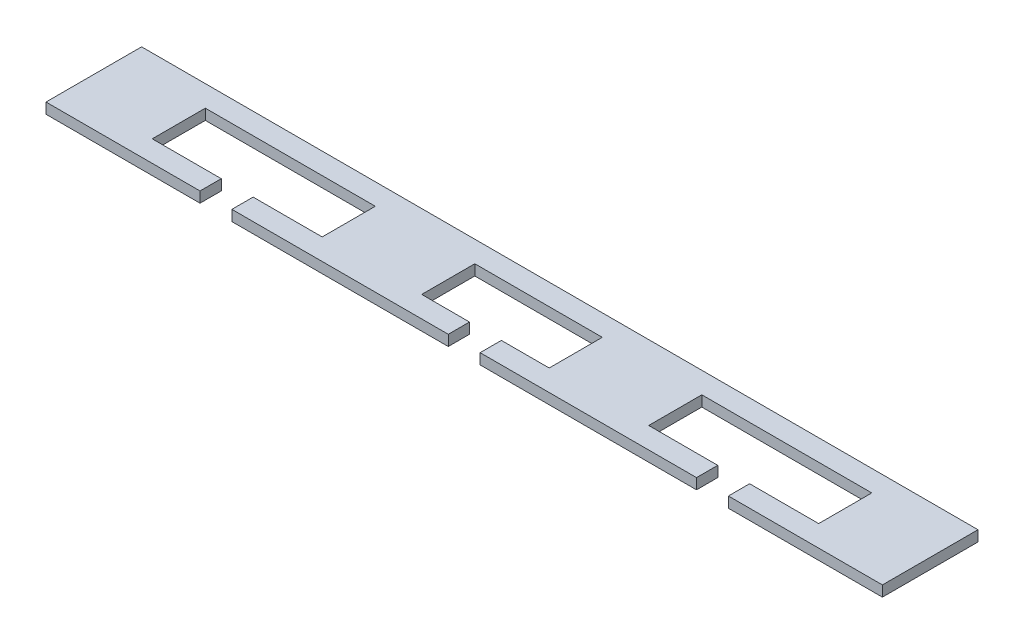
ISO-10303-21;
HEADER;
FILE_DESCRIPTION(('STEP AP214'),'2;1');
FILE_NAME('part.step','',(''),(''),'','','');
FILE_SCHEMA(('AUTOMOTIVE_DESIGN { 1 0 10303 214 1 1 1 1 }'));
ENDSEC;
DATA;
#1=APPLICATION_CONTEXT('core data for automotive mechanical design processes');
#2=APPLICATION_PROTOCOL_DEFINITION('international standard','automotive_design',2000,#1);
#3=PRODUCT_CONTEXT('',#1,'mechanical');
#4=PRODUCT('Part','Part','',(#3));
#5=PRODUCT_RELATED_PRODUCT_CATEGORY('part','',(#4));
#6=PRODUCT_DEFINITION_FORMATION('','',#4);
#7=PRODUCT_DEFINITION_CONTEXT('part definition',#1,'design');
#8=PRODUCT_DEFINITION('design','',#6,#7);
#9=PRODUCT_DEFINITION_SHAPE('','',#8);
#10=(LENGTH_UNIT() NAMED_UNIT(*) SI_UNIT(.MILLI.,.METRE.));
#11=(NAMED_UNIT(*) PLANE_ANGLE_UNIT() SI_UNIT($,.RADIAN.));
#12=(NAMED_UNIT(*) SI_UNIT($,.STERADIAN.) SOLID_ANGLE_UNIT());
#13=UNCERTAINTY_MEASURE_WITH_UNIT(LENGTH_MEASURE(1.E-05),#10,'distance_accuracy_value','');
#14=(GEOMETRIC_REPRESENTATION_CONTEXT(3) GLOBAL_UNCERTAINTY_ASSIGNED_CONTEXT((#13)) GLOBAL_UNIT_ASSIGNED_CONTEXT((#10,
#11,#12)) REPRESENTATION_CONTEXT('',''));
#15=CARTESIAN_POINT('',(0.,0.,0.));
#16=DIRECTION('',(0.,0.,1.));
#17=DIRECTION('',(1.,0.,0.));
#18=AXIS2_PLACEMENT_3D('',#15,#16,#17);
#19=CARTESIAN_POINT('',(0.,12.7,0.));
#20=DIRECTION('',(0.,0.,-1.));
#21=DIRECTION('',(-1.,0.,0.));
#22=AXIS2_PLACEMENT_3D('',#19,#20,#21);
#23=PLANE('',#22);
#24=DIRECTION('',(1.,0.,0.));
#25=VECTOR('',#24,1.);
#26=CARTESIAN_POINT('',(0.,0.,0.));
#27=LINE('',#26,#25);
#28=CARTESIAN_POINT('',(0.,0.,0.));
#29=VERTEX_POINT('',#28);
#30=CARTESIAN_POINT('',(184.15,0.,0.));
#31=VERTEX_POINT('',#30);
#32=EDGE_CURVE('E260',#29,#31,#27,.T.);
#33=ORIENTED_EDGE('',*,*,#32,.T.);
#34=DIRECTION('',(0.,-1.,0.));
#35=VECTOR('',#34,1.);
#36=CARTESIAN_POINT('',(184.15,12.7,0.));
#37=LINE('',#36,#35);
#38=CARTESIAN_POINT('',(184.15,12.7,0.));
#39=VERTEX_POINT('',#38);
#40=EDGE_CURVE('E11',#39,#31,#37,.T.);
#41=ORIENTED_EDGE('',*,*,#40,.F.);
#42=DIRECTION('',(1.,0.,0.));
#43=VECTOR('',#42,1.);
#44=CARTESIAN_POINT('',(0.,12.7,0.));
#45=LINE('',#44,#43);
#46=CARTESIAN_POINT('',(0.,12.7,0.));
#47=VERTEX_POINT('',#46);
#48=EDGE_CURVE('E344',#47,#39,#45,.T.);
#49=ORIENTED_EDGE('',*,*,#48,.F.);
#50=DIRECTION('',(0.,-1.,0.));
#51=VECTOR('',#50,1.);
#52=CARTESIAN_POINT('',(0.,12.7,0.));
#53=LINE('',#52,#51);
#54=EDGE_CURVE('E256',#47,#29,#53,.T.);
#55=ORIENTED_EDGE('',*,*,#54,.T.);
#56=EDGE_LOOP('',(#33,#41,#49,#55));
#57=FACE_BOUND('',#56,.T.);
#58=ADVANCED_FACE('F39',(#57),#23,.F.);
#59=CARTESIAN_POINT('',(184.15,12.7,-25.3999999999999));
#60=DIRECTION('',(-1.,0.,0.));
#61=DIRECTION('',(0.,0.,1.));
#62=AXIS2_PLACEMENT_3D('',#59,#60,#61);
#63=PLANE('',#62);
#64=DIRECTION('',(0.,0.,-1.));
#65=VECTOR('',#64,1.);
#66=CARTESIAN_POINT('',(184.15,0.,-25.3999999999999));
#67=LINE('',#66,#65);
#68=CARTESIAN_POINT('',(184.15,0.,-25.3999999999999));
#69=VERTEX_POINT('',#68);
#70=EDGE_CURVE('E264',#31,#69,#67,.T.);
#71=ORIENTED_EDGE('',*,*,#70,.T.);
#72=DIRECTION('',(0.,-1.,0.));
#73=VECTOR('',#72,1.);
#74=CARTESIAN_POINT('',(184.15,12.7,-25.3999999999999));
#75=LINE('',#74,#73);
#76=CARTESIAN_POINT('',(184.15,12.7,-25.3999999999999));
#77=VERTEX_POINT('',#76);
#78=EDGE_CURVE('E48',#77,#69,#75,.T.);
#79=ORIENTED_EDGE('',*,*,#78,.F.);
#80=DIRECTION('',(0.,0.,-1.));
#81=VECTOR('',#80,1.);
#82=CARTESIAN_POINT('',(184.15,12.7,-25.3999999999999));
#83=LINE('',#82,#81);
#84=EDGE_CURVE('E159',#39,#77,#83,.T.);
#85=ORIENTED_EDGE('',*,*,#84,.F.);
#86=ORIENTED_EDGE('',*,*,#40,.T.);
#87=EDGE_LOOP('',(#71,#79,#85,#86));
#88=FACE_BOUND('',#87,.T.);
#89=ADVANCED_FACE('F550',(#88),#63,.F.);
#90=CARTESIAN_POINT('',(101.6,12.7,-25.3999999999999));
#91=DIRECTION('',(0.,0.,1.));
#92=DIRECTION('',(1.,0.,0.));
#93=AXIS2_PLACEMENT_3D('',#90,#91,#92);
#94=PLANE('',#93);
#95=DIRECTION('',(-1.,0.,0.));
#96=VECTOR('',#95,1.);
#97=CARTESIAN_POINT('',(101.6,0.,-25.3999999999999));
#98=LINE('',#97,#96);
#99=CARTESIAN_POINT('',(101.6,0.,-25.3999999999999));
#100=VERTEX_POINT('',#99);
#101=EDGE_CURVE('E267',#69,#100,#98,.T.);
#102=ORIENTED_EDGE('',*,*,#101,.T.);
#103=DIRECTION('',(0.,-1.,0.));
#104=VECTOR('',#103,1.);
#105=CARTESIAN_POINT('',(101.6,12.7,-25.3999999999999));
#106=LINE('',#105,#104);
#107=CARTESIAN_POINT('',(101.6,12.7,-25.3999999999999));
#108=VERTEX_POINT('',#107);
#109=EDGE_CURVE('E435',#108,#100,#106,.T.);
#110=ORIENTED_EDGE('',*,*,#109,.F.);
#111=DIRECTION('',(-1.,0.,0.));
#112=VECTOR('',#111,1.);
#113=CARTESIAN_POINT('',(101.6,12.7,-25.3999999999999));
#114=LINE('',#113,#112);
#115=EDGE_CURVE('E445',#77,#108,#114,.T.);
#116=ORIENTED_EDGE('',*,*,#115,.F.);
#117=ORIENTED_EDGE('',*,*,#78,.T.);
#118=EDGE_LOOP('',(#102,#110,#116,#117));
#119=FACE_BOUND('',#118,.T.);
#120=ADVANCED_FACE('F443',(#119),#94,.F.);
#121=CARTESIAN_POINT('',(101.6,12.7,-25.3999999999999));
#122=DIRECTION('',(-1.,0.,0.));
#123=DIRECTION('',(0.,0.,1.));
#124=AXIS2_PLACEMENT_3D('',#121,#122,#123);
#125=PLANE('',#124);
#126=DIRECTION('',(0.,0.,-1.));
#127=VECTOR('',#126,1.);
#128=CARTESIAN_POINT('',(101.6,0.,-25.3999999999999));
#129=LINE('',#128,#127);
#130=CARTESIAN_POINT('',(101.6,0.,-88.9000000000001));
#131=VERTEX_POINT('',#130);
#132=EDGE_CURVE('E270',#100,#131,#129,.T.);
#133=ORIENTED_EDGE('',*,*,#132,.T.);
#134=DIRECTION('',(0.,-1.,0.));
#135=VECTOR('',#134,1.);
#136=CARTESIAN_POINT('',(101.6,12.7,-88.9000000000001));
#137=LINE('',#136,#135);
#138=CARTESIAN_POINT('',(101.6,12.7,-88.9000000000001));
#139=VERTEX_POINT('',#138);
#140=EDGE_CURVE('E431',#139,#131,#137,.T.);
#141=ORIENTED_EDGE('',*,*,#140,.F.);
#142=DIRECTION('',(0.,0.,-1.));
#143=VECTOR('',#142,1.);
#144=CARTESIAN_POINT('',(101.6,12.7,-25.3999999999999));
#145=LINE('',#144,#143);
#146=EDGE_CURVE('E464',#108,#139,#145,.T.);
#147=ORIENTED_EDGE('',*,*,#146,.F.);
#148=ORIENTED_EDGE('',*,*,#109,.T.);
#149=EDGE_LOOP('',(#133,#141,#147,#148));
#150=FACE_BOUND('',#149,.T.);
#151=ADVANCED_FACE('F454',(#150),#125,.F.);
#152=CARTESIAN_POINT('',(101.6,12.7,-88.9000000000001));
#153=DIRECTION('',(0.,0.,-1.));
#154=DIRECTION('',(-1.,0.,0.));
#155=AXIS2_PLACEMENT_3D('',#152,#153,#154);
#156=PLANE('',#155);
#157=DIRECTION('',(1.,0.,0.));
#158=VECTOR('',#157,1.);
#159=CARTESIAN_POINT('',(101.6,0.,-88.9000000000001));
#160=LINE('',#159,#158);
#161=CARTESIAN_POINT('',(304.8,0.,-88.9000000000001));
#162=VERTEX_POINT('',#161);
#163=EDGE_CURVE('E273',#131,#162,#160,.T.);
#164=ORIENTED_EDGE('',*,*,#163,.T.);
#165=DIRECTION('',(0.,-1.,0.));
#166=VECTOR('',#165,1.);
#167=CARTESIAN_POINT('',(304.8,12.7,-88.9000000000001));
#168=LINE('',#167,#166);
#169=CARTESIAN_POINT('',(304.8,12.7,-88.9000000000001));
#170=VERTEX_POINT('',#169);
#171=EDGE_CURVE('E427',#170,#162,#168,.T.);
#172=ORIENTED_EDGE('',*,*,#171,.F.);
#173=DIRECTION('',(1.,0.,0.));
#174=VECTOR('',#173,1.);
#175=CARTESIAN_POINT('',(101.6,12.7,-88.9000000000001));
#176=LINE('',#175,#174);
#177=EDGE_CURVE('E460',#139,#170,#176,.T.);
#178=ORIENTED_EDGE('',*,*,#177,.F.);
#179=ORIENTED_EDGE('',*,*,#140,.T.);
#180=EDGE_LOOP('',(#164,#172,#178,#179));
#181=FACE_BOUND('',#180,.T.);
#182=ADVANCED_FACE('F458',(#181),#156,.F.);
#183=CARTESIAN_POINT('',(304.8,12.7,-25.3999999999999));
#184=DIRECTION('',(1.,0.,0.));
#185=DIRECTION('',(0.,0.,-1.));
#186=AXIS2_PLACEMENT_3D('',#183,#184,#185);
#187=PLANE('',#186);
#188=DIRECTION('',(0.,0.,1.));
#189=VECTOR('',#188,1.);
#190=CARTESIAN_POINT('',(304.8,0.,-25.3999999999999));
#191=LINE('',#190,#189);
#192=CARTESIAN_POINT('',(304.8,0.,-25.3999999999999));
#193=VERTEX_POINT('',#192);
#194=EDGE_CURVE('E276',#162,#193,#191,.T.);
#195=ORIENTED_EDGE('',*,*,#194,.T.);
#196=DIRECTION('',(0.,-1.,0.));
#197=VECTOR('',#196,1.);
#198=CARTESIAN_POINT('',(304.8,12.7,-25.3999999999999));
#199=LINE('',#198,#197);
#200=CARTESIAN_POINT('',(304.8,12.7,-25.3999999999999));
#201=VERTEX_POINT('',#200);
#202=EDGE_CURVE('E423',#201,#193,#199,.T.);
#203=ORIENTED_EDGE('',*,*,#202,.F.);
#204=DIRECTION('',(0.,0.,1.));
#205=VECTOR('',#204,1.);
#206=CARTESIAN_POINT('',(304.8,12.7,-25.3999999999999));
#207=LINE('',#206,#205);
#208=EDGE_CURVE('E463',#170,#201,#207,.T.);
#209=ORIENTED_EDGE('',*,*,#208,.F.);
#210=ORIENTED_EDGE('',*,*,#171,.T.);
#211=EDGE_LOOP('',(#195,#203,#209,#210));
#212=FACE_BOUND('',#211,.T.);
#213=ADVANCED_FACE('F563',(#212),#187,.F.);
#214=CARTESIAN_POINT('',(222.25,12.7,-25.3999999999999));
#215=DIRECTION('',(0.,0.,1.));
#216=DIRECTION('',(1.,0.,0.));
#217=AXIS2_PLACEMENT_3D('',#214,#215,#216);
#218=PLANE('',#217);
#219=DIRECTION('',(-1.,0.,0.));
#220=VECTOR('',#219,1.);
#221=CARTESIAN_POINT('',(222.25,0.,-25.3999999999999));
#222=LINE('',#221,#220);
#223=CARTESIAN_POINT('',(222.25,0.,-25.3999999999999));
#224=VERTEX_POINT('',#223);
#225=EDGE_CURVE('E279',#193,#224,#222,.T.);
#226=ORIENTED_EDGE('',*,*,#225,.T.);
#227=DIRECTION('',(0.,-1.,0.));
#228=VECTOR('',#227,1.);
#229=CARTESIAN_POINT('',(222.25,12.7,-25.3999999999999));
#230=LINE('',#229,#228);
#231=CARTESIAN_POINT('',(222.25,12.7,-25.3999999999999));
#232=VERTEX_POINT('',#231);
#233=EDGE_CURVE('E419',#232,#224,#230,.T.);
#234=ORIENTED_EDGE('',*,*,#233,.F.);
#235=DIRECTION('',(-1.,0.,0.));
#236=VECTOR('',#235,1.);
#237=CARTESIAN_POINT('',(222.25,12.7,-25.3999999999999));
#238=LINE('',#237,#236);
#239=EDGE_CURVE('E468',#201,#232,#238,.T.);
#240=ORIENTED_EDGE('',*,*,#239,.F.);
#241=ORIENTED_EDGE('',*,*,#202,.T.);
#242=EDGE_LOOP('',(#226,#234,#240,#241));
#243=FACE_BOUND('',#242,.T.);
#244=ADVANCED_FACE('F566',(#243),#218,.F.);
#245=CARTESIAN_POINT('',(222.25,12.7,-25.3999999999999));
#246=DIRECTION('',(1.,0.,0.));
#247=DIRECTION('',(0.,0.,-1.));
#248=AXIS2_PLACEMENT_3D('',#245,#246,#247);
#249=PLANE('',#248);
#250=DIRECTION('',(0.,0.,1.));
#251=VECTOR('',#250,1.);
#252=CARTESIAN_POINT('',(222.25,0.,-25.3999999999999));
#253=LINE('',#252,#251);
#254=CARTESIAN_POINT('',(222.25,0.,0.));
#255=VERTEX_POINT('',#254);
#256=EDGE_CURVE('E282',#224,#255,#253,.T.);
#257=ORIENTED_EDGE('',*,*,#256,.T.);
#258=DIRECTION('',(0.,-1.,0.));
#259=VECTOR('',#258,1.);
#260=CARTESIAN_POINT('',(222.25,12.7,0.));
#261=LINE('',#260,#259);
#262=CARTESIAN_POINT('',(222.25,12.7,0.));
#263=VERTEX_POINT('',#262);
#264=EDGE_CURVE('E415',#263,#255,#261,.T.);
#265=ORIENTED_EDGE('',*,*,#264,.F.);
#266=DIRECTION('',(0.,0.,1.));
#267=VECTOR('',#266,1.);
#268=CARTESIAN_POINT('',(222.25,12.7,-25.3999999999999));
#269=LINE('',#268,#267);
#270=EDGE_CURVE('E475',#232,#263,#269,.T.);
#271=ORIENTED_EDGE('',*,*,#270,.F.);
#272=ORIENTED_EDGE('',*,*,#233,.T.);
#273=EDGE_LOOP('',(#257,#265,#271,#272));
#274=FACE_BOUND('',#273,.T.);
#275=ADVANCED_FACE('F570',(#274),#249,.F.);
#276=CARTESIAN_POINT('',(480.95027,12.7,0.));
#277=DIRECTION('',(0.,0.,-1.));
#278=DIRECTION('',(-1.,0.,0.));
#279=AXIS2_PLACEMENT_3D('',#276,#277,#278);
#280=PLANE('',#279);
#281=DIRECTION('',(1.,0.,0.));
#282=VECTOR('',#281,1.);
#283=CARTESIAN_POINT('',(480.95027,0.,0.));
#284=LINE('',#283,#282);
#285=CARTESIAN_POINT('',(480.95027,0.,0.));
#286=VERTEX_POINT('',#285);
#287=EDGE_CURVE('E286',#255,#286,#284,.T.);
#288=ORIENTED_EDGE('',*,*,#287,.T.);
#289=DIRECTION('',(0.,-1.,0.));
#290=VECTOR('',#289,1.);
#291=CARTESIAN_POINT('',(480.95027,12.7,0.));
#292=LINE('',#291,#290);
#293=CARTESIAN_POINT('',(480.95027,12.7,0.));
#294=VERTEX_POINT('',#293);
#295=EDGE_CURVE('E411',#294,#286,#292,.T.);
#296=ORIENTED_EDGE('',*,*,#295,.F.);
#297=DIRECTION('',(1.,0.,0.));
#298=VECTOR('',#297,1.);
#299=CARTESIAN_POINT('',(222.25,12.7,0.));
#300=LINE('',#299,#298);
#301=EDGE_CURVE('E478',#263,#294,#300,.T.);
#302=ORIENTED_EDGE('',*,*,#301,.F.);
#303=ORIENTED_EDGE('',*,*,#264,.T.);
#304=EDGE_LOOP('',(#288,#296,#302,#303));
#305=FACE_BOUND('',#304,.T.);
#306=ADVANCED_FACE('F574',(#305),#280,.F.);
#307=CARTESIAN_POINT('',(480.95027,12.7,-25.4));
#308=DIRECTION('',(-1.,0.,0.));
#309=DIRECTION('',(0.,0.,1.));
#310=AXIS2_PLACEMENT_3D('',#307,#308,#309);
#311=PLANE('',#310);
#312=DIRECTION('',(0.,0.,-1.));
#313=VECTOR('',#312,1.);
#314=CARTESIAN_POINT('',(480.95027,0.,-25.4));
#315=LINE('',#314,#313);
#316=CARTESIAN_POINT('',(480.95027,0.,-25.4));
#317=VERTEX_POINT('',#316);
#318=EDGE_CURVE('E289',#286,#317,#315,.T.);
#319=ORIENTED_EDGE('',*,*,#318,.T.);
#320=DIRECTION('',(0.,-1.,0.));
#321=VECTOR('',#320,1.);
#322=CARTESIAN_POINT('',(480.95027,12.7,-25.4));
#323=LINE('',#322,#321);
#324=CARTESIAN_POINT('',(480.95027,12.7,-25.4));
#325=VERTEX_POINT('',#324);
#326=EDGE_CURVE('E407',#325,#317,#323,.T.);
#327=ORIENTED_EDGE('',*,*,#326,.F.);
#328=DIRECTION('',(0.,0.,-1.));
#329=VECTOR('',#328,1.);
#330=CARTESIAN_POINT('',(480.95027,12.7,-25.4));
#331=LINE('',#330,#329);
#332=EDGE_CURVE('E481',#294,#325,#331,.T.);
#333=ORIENTED_EDGE('',*,*,#332,.F.);
#334=ORIENTED_EDGE('',*,*,#295,.T.);
#335=EDGE_LOOP('',(#319,#327,#333,#334));
#336=FACE_BOUND('',#335,.T.);
#337=ADVANCED_FACE('F578',(#336),#311,.F.);
#338=CARTESIAN_POINT('',(423.80027,12.7,-25.4));
#339=DIRECTION('',(0.,0.,1.));
#340=DIRECTION('',(1.,0.,0.));
#341=AXIS2_PLACEMENT_3D('',#338,#339,#340);
#342=PLANE('',#341);
#343=DIRECTION('',(-1.,0.,0.));
#344=VECTOR('',#343,1.);
#345=CARTESIAN_POINT('',(423.80027,0.,-25.4));
#346=LINE('',#345,#344);
#347=CARTESIAN_POINT('',(423.80027,0.,-25.4));
#348=VERTEX_POINT('',#347);
#349=EDGE_CURVE('E292',#317,#348,#346,.T.);
#350=ORIENTED_EDGE('',*,*,#349,.T.);
#351=DIRECTION('',(0.,-1.,0.));
#352=VECTOR('',#351,1.);
#353=CARTESIAN_POINT('',(423.80027,12.7,-25.4));
#354=LINE('',#353,#352);
#355=CARTESIAN_POINT('',(423.80027,12.7,-25.4));
#356=VERTEX_POINT('',#355);
#357=EDGE_CURVE('E403',#356,#348,#354,.T.);
#358=ORIENTED_EDGE('',*,*,#357,.F.);
#359=DIRECTION('',(-1.,0.,0.));
#360=VECTOR('',#359,1.);
#361=CARTESIAN_POINT('',(423.80027,12.7,-25.4));
#362=LINE('',#361,#360);
#363=EDGE_CURVE('E484',#325,#356,#362,.T.);
#364=ORIENTED_EDGE('',*,*,#363,.F.);
#365=ORIENTED_EDGE('',*,*,#326,.T.);
#366=EDGE_LOOP('',(#350,#358,#364,#365));
#367=FACE_BOUND('',#366,.T.);
#368=ADVANCED_FACE('F582',(#367),#342,.F.);
#369=CARTESIAN_POINT('',(423.80027,12.7,-88.9));
#370=DIRECTION('',(-1.,0.,0.));
#371=DIRECTION('',(0.,0.,1.));
#372=AXIS2_PLACEMENT_3D('',#369,#370,#371);
#373=PLANE('',#372);
#374=DIRECTION('',(0.,0.,-1.));
#375=VECTOR('',#374,1.);
#376=CARTESIAN_POINT('',(423.80027,0.,-88.9));
#377=LINE('',#376,#375);
#378=CARTESIAN_POINT('',(423.80027,0.,-88.9));
#379=VERTEX_POINT('',#378);
#380=EDGE_CURVE('E295',#348,#379,#377,.T.);
#381=ORIENTED_EDGE('',*,*,#380,.T.);
#382=DIRECTION('',(0.,-1.,0.));
#383=VECTOR('',#382,1.);
#384=CARTESIAN_POINT('',(423.80027,12.7,-88.9));
#385=LINE('',#384,#383);
#386=CARTESIAN_POINT('',(423.80027,12.7,-88.9));
#387=VERTEX_POINT('',#386);
#388=EDGE_CURVE('E399',#387,#379,#385,.T.);
#389=ORIENTED_EDGE('',*,*,#388,.F.);
#390=DIRECTION('',(0.,0.,-1.));
#391=VECTOR('',#390,1.);
#392=CARTESIAN_POINT('',(423.80027,12.7,-88.9));
#393=LINE('',#392,#391);
#394=EDGE_CURVE('E487',#356,#387,#393,.T.);
#395=ORIENTED_EDGE('',*,*,#394,.F.);
#396=ORIENTED_EDGE('',*,*,#357,.T.);
#397=EDGE_LOOP('',(#381,#389,#395,#396));
#398=FACE_BOUND('',#397,.T.);
#399=ADVANCED_FACE('F586',(#398),#373,.F.);
#400=CARTESIAN_POINT('',(423.80027,12.7,-88.9));
#401=DIRECTION('',(0.,0.,-1.));
#402=DIRECTION('',(-1.,0.,0.));
#403=AXIS2_PLACEMENT_3D('',#400,#401,#402);
#404=PLANE('',#403);
#405=DIRECTION('',(1.,0.,0.));
#406=VECTOR('',#405,1.);
#407=CARTESIAN_POINT('',(423.80027,0.,-88.9));
#408=LINE('',#407,#406);
#409=CARTESIAN_POINT('',(576.20027,0.,-88.9));
#410=VERTEX_POINT('',#409);
#411=EDGE_CURVE('E298',#379,#410,#408,.T.);
#412=ORIENTED_EDGE('',*,*,#411,.T.);
#413=DIRECTION('',(0.,-1.,0.));
#414=VECTOR('',#413,1.);
#415=CARTESIAN_POINT('',(576.20027,12.7,-88.9));
#416=LINE('',#415,#414);
#417=CARTESIAN_POINT('',(576.20027,12.7,-88.9));
#418=VERTEX_POINT('',#417);
#419=EDGE_CURVE('E395',#418,#410,#416,.T.);
#420=ORIENTED_EDGE('',*,*,#419,.F.);
#421=DIRECTION('',(1.,0.,0.));
#422=VECTOR('',#421,1.);
#423=CARTESIAN_POINT('',(423.80027,12.7,-88.9));
#424=LINE('',#423,#422);
#425=EDGE_CURVE('E490',#387,#418,#424,.T.);
#426=ORIENTED_EDGE('',*,*,#425,.F.);
#427=ORIENTED_EDGE('',*,*,#388,.T.);
#428=EDGE_LOOP('',(#412,#420,#426,#427));
#429=FACE_BOUND('',#428,.T.);
#430=ADVANCED_FACE('F590',(#429),#404,.F.);
#431=CARTESIAN_POINT('',(576.20027,12.7,-88.9));
#432=DIRECTION('',(1.,0.,0.));
#433=DIRECTION('',(0.,0.,-1.));
#434=AXIS2_PLACEMENT_3D('',#431,#432,#433);
#435=PLANE('',#434);
#436=DIRECTION('',(0.,0.,1.));
#437=VECTOR('',#436,1.);
#438=CARTESIAN_POINT('',(576.20027,0.,-88.9));
#439=LINE('',#438,#437);
#440=CARTESIAN_POINT('',(576.20027,0.,-25.4));
#441=VERTEX_POINT('',#440);
#442=EDGE_CURVE('E301',#410,#441,#439,.T.);
#443=ORIENTED_EDGE('',*,*,#442,.T.);
#444=DIRECTION('',(0.,-1.,0.));
#445=VECTOR('',#444,1.);
#446=CARTESIAN_POINT('',(576.20027,12.7,-25.4));
#447=LINE('',#446,#445);
#448=CARTESIAN_POINT('',(576.20027,12.7,-25.4));
#449=VERTEX_POINT('',#448);
#450=EDGE_CURVE('E391',#449,#441,#447,.T.);
#451=ORIENTED_EDGE('',*,*,#450,.F.);
#452=DIRECTION('',(0.,0.,1.));
#453=VECTOR('',#452,1.);
#454=CARTESIAN_POINT('',(576.20027,12.7,-88.9));
#455=LINE('',#454,#453);
#456=EDGE_CURVE('E493',#418,#449,#455,.T.);
#457=ORIENTED_EDGE('',*,*,#456,.F.);
#458=ORIENTED_EDGE('',*,*,#419,.T.);
#459=EDGE_LOOP('',(#443,#451,#457,#458));
#460=FACE_BOUND('',#459,.T.);
#461=ADVANCED_FACE('F594',(#460),#435,.F.);
#462=CARTESIAN_POINT('',(519.05027,12.7,-25.4));
#463=DIRECTION('',(0.,0.,1.));
#464=DIRECTION('',(1.,0.,0.));
#465=AXIS2_PLACEMENT_3D('',#462,#463,#464);
#466=PLANE('',#465);
#467=DIRECTION('',(-1.,0.,0.));
#468=VECTOR('',#467,1.);
#469=CARTESIAN_POINT('',(519.05027,0.,-25.4));
#470=LINE('',#469,#468);
#471=CARTESIAN_POINT('',(519.05027,0.,-25.4));
#472=VERTEX_POINT('',#471);
#473=EDGE_CURVE('E304',#441,#472,#470,.T.);
#474=ORIENTED_EDGE('',*,*,#473,.T.);
#475=DIRECTION('',(0.,-1.,0.));
#476=VECTOR('',#475,1.);
#477=CARTESIAN_POINT('',(519.05027,12.7,-25.4));
#478=LINE('',#477,#476);
#479=CARTESIAN_POINT('',(519.05027,12.7,-25.4));
#480=VERTEX_POINT('',#479);
#481=EDGE_CURVE('E387',#480,#472,#478,.T.);
#482=ORIENTED_EDGE('',*,*,#481,.F.);
#483=DIRECTION('',(-1.,0.,0.));
#484=VECTOR('',#483,1.);
#485=CARTESIAN_POINT('',(519.05027,12.7,-25.4));
#486=LINE('',#485,#484);
#487=EDGE_CURVE('E496',#449,#480,#486,.T.);
#488=ORIENTED_EDGE('',*,*,#487,.F.);
#489=ORIENTED_EDGE('',*,*,#450,.T.);
#490=EDGE_LOOP('',(#474,#482,#488,#489));
#491=FACE_BOUND('',#490,.T.);
#492=ADVANCED_FACE('F598',(#491),#466,.F.);
#493=CARTESIAN_POINT('',(519.05027,12.7,-25.4));
#494=DIRECTION('',(1.,0.,0.));
#495=DIRECTION('',(0.,0.,-1.));
#496=AXIS2_PLACEMENT_3D('',#493,#494,#495);
#497=PLANE('',#496);
#498=DIRECTION('',(0.,0.,1.));
#499=VECTOR('',#498,1.);
#500=CARTESIAN_POINT('',(519.05027,0.,-25.4));
#501=LINE('',#500,#499);
#502=CARTESIAN_POINT('',(519.05027,0.,0.));
#503=VERTEX_POINT('',#502);
#504=EDGE_CURVE('E307',#472,#503,#501,.T.);
#505=ORIENTED_EDGE('',*,*,#504,.T.);
#506=DIRECTION('',(0.,-1.,0.));
#507=VECTOR('',#506,1.);
#508=CARTESIAN_POINT('',(519.05027,12.7,0.));
#509=LINE('',#508,#507);
#510=CARTESIAN_POINT('',(519.05027,12.7,0.));
#511=VERTEX_POINT('',#510);
#512=EDGE_CURVE('E383',#511,#503,#509,.T.);
#513=ORIENTED_EDGE('',*,*,#512,.F.);
#514=DIRECTION('',(0.,0.,1.));
#515=VECTOR('',#514,1.);
#516=CARTESIAN_POINT('',(519.05027,12.7,-25.4));
#517=LINE('',#516,#515);
#518=EDGE_CURVE('E499',#480,#511,#517,.T.);
#519=ORIENTED_EDGE('',*,*,#518,.F.);
#520=ORIENTED_EDGE('',*,*,#481,.T.);
#521=EDGE_LOOP('',(#505,#513,#519,#520));
#522=FACE_BOUND('',#521,.T.);
#523=ADVANCED_FACE('F602',(#522),#497,.F.);
#524=CARTESIAN_POINT('',(550.80027,12.7,0.));
#525=DIRECTION('',(0.,0.,-1.));
#526=DIRECTION('',(-1.,0.,0.));
#527=AXIS2_PLACEMENT_3D('',#524,#525,#526);
#528=PLANE('',#527);
#529=DIRECTION('',(1.,0.,0.));
#530=VECTOR('',#529,1.);
#531=CARTESIAN_POINT('',(550.80027,0.,0.));
#532=LINE('',#531,#530);
#533=CARTESIAN_POINT('',(777.75054,0.,0.));
#534=VERTEX_POINT('',#533);
#535=EDGE_CURVE('E311',#503,#534,#532,.T.);
#536=ORIENTED_EDGE('',*,*,#535,.T.);
#537=DIRECTION('',(0.,-1.,0.));
#538=VECTOR('',#537,1.);
#539=CARTESIAN_POINT('',(777.75054,12.7,0.));
#540=LINE('',#539,#538);
#541=CARTESIAN_POINT('',(777.75054,12.7,0.));
#542=VERTEX_POINT('',#541);
#543=EDGE_CURVE('E379',#542,#534,#540,.T.);
#544=ORIENTED_EDGE('',*,*,#543,.F.);
#545=DIRECTION('',(1.,0.,0.));
#546=VECTOR('',#545,1.);
#547=CARTESIAN_POINT('',(519.05027,12.7,0.));
#548=LINE('',#547,#546);
#549=EDGE_CURVE('E502',#511,#542,#548,.T.);
#550=ORIENTED_EDGE('',*,*,#549,.F.);
#551=ORIENTED_EDGE('',*,*,#512,.T.);
#552=EDGE_LOOP('',(#536,#544,#550,#551));
#553=FACE_BOUND('',#552,.T.);
#554=ADVANCED_FACE('F606',(#553),#528,.F.);
#555=CARTESIAN_POINT('',(777.75054,12.7,-25.4));
#556=DIRECTION('',(-1.,0.,0.));
#557=DIRECTION('',(0.,0.,1.));
#558=AXIS2_PLACEMENT_3D('',#555,#556,#557);
#559=PLANE('',#558);
#560=DIRECTION('',(0.,0.,-1.));
#561=VECTOR('',#560,1.);
#562=CARTESIAN_POINT('',(777.75054,0.,-25.4));
#563=LINE('',#562,#561);
#564=CARTESIAN_POINT('',(777.75054,0.,-25.4));
#565=VERTEX_POINT('',#564);
#566=EDGE_CURVE('E314',#534,#565,#563,.T.);
#567=ORIENTED_EDGE('',*,*,#566,.T.);
#568=DIRECTION('',(0.,-1.,0.));
#569=VECTOR('',#568,1.);
#570=CARTESIAN_POINT('',(777.75054,12.7,-25.4));
#571=LINE('',#570,#569);
#572=CARTESIAN_POINT('',(777.75054,12.7,-25.4));
#573=VERTEX_POINT('',#572);
#574=EDGE_CURVE('E375',#573,#565,#571,.T.);
#575=ORIENTED_EDGE('',*,*,#574,.F.);
#576=DIRECTION('',(0.,0.,-1.));
#577=VECTOR('',#576,1.);
#578=CARTESIAN_POINT('',(777.75054,12.7,-25.4));
#579=LINE('',#578,#577);
#580=EDGE_CURVE('E505',#542,#573,#579,.T.);
#581=ORIENTED_EDGE('',*,*,#580,.F.);
#582=ORIENTED_EDGE('',*,*,#543,.T.);
#583=EDGE_LOOP('',(#567,#575,#581,#582));
#584=FACE_BOUND('',#583,.T.);
#585=ADVANCED_FACE('F610',(#584),#559,.F.);
#586=CARTESIAN_POINT('',(777.75054,12.7,-25.4));
#587=DIRECTION('',(0.,0.,1.));
#588=DIRECTION('',(1.,0.,0.));
#589=AXIS2_PLACEMENT_3D('',#586,#587,#588);
#590=PLANE('',#589);
#591=DIRECTION('',(-1.,0.,0.));
#592=VECTOR('',#591,1.);
#593=CARTESIAN_POINT('',(777.75054,0.,-25.4));
#594=LINE('',#593,#592);
#595=CARTESIAN_POINT('',(695.20054,0.,-25.3999999999999));
#596=VERTEX_POINT('',#595);
#597=EDGE_CURVE('E317',#565,#596,#594,.T.);
#598=ORIENTED_EDGE('',*,*,#597,.T.);
#599=DIRECTION('',(0.,-1.,0.));
#600=VECTOR('',#599,1.);
#601=CARTESIAN_POINT('',(695.20054,12.7,-25.3999999999999));
#602=LINE('',#601,#600);
#603=CARTESIAN_POINT('',(695.20054,12.7,-25.3999999999999));
#604=VERTEX_POINT('',#603);
#605=EDGE_CURVE('E371',#604,#596,#602,.T.);
#606=ORIENTED_EDGE('',*,*,#605,.F.);
#607=DIRECTION('',(-1.,0.,0.));
#608=VECTOR('',#607,1.);
#609=CARTESIAN_POINT('',(777.75054,12.7,-25.4));
#610=LINE('',#609,#608);
#611=EDGE_CURVE('E508',#573,#604,#610,.T.);
#612=ORIENTED_EDGE('',*,*,#611,.F.);
#613=ORIENTED_EDGE('',*,*,#574,.T.);
#614=EDGE_LOOP('',(#598,#606,#612,#613));
#615=FACE_BOUND('',#614,.T.);
#616=ADVANCED_FACE('F614',(#615),#590,.F.);
#617=CARTESIAN_POINT('',(695.20054,12.7,-25.3999999999999));
#618=DIRECTION('',(-1.,0.,0.));
#619=DIRECTION('',(0.,0.,1.));
#620=AXIS2_PLACEMENT_3D('',#617,#618,#619);
#621=PLANE('',#620);
#622=DIRECTION('',(0.,0.,-1.));
#623=VECTOR('',#622,1.);
#624=CARTESIAN_POINT('',(695.20054,0.,-25.3999999999999));
#625=LINE('',#624,#623);
#626=CARTESIAN_POINT('',(695.20054,0.,-88.9000000000001));
#627=VERTEX_POINT('',#626);
#628=EDGE_CURVE('E320',#596,#627,#625,.T.);
#629=ORIENTED_EDGE('',*,*,#628,.T.);
#630=DIRECTION('',(0.,-1.,0.));
#631=VECTOR('',#630,1.);
#632=CARTESIAN_POINT('',(695.20054,12.7,-88.9000000000001));
#633=LINE('',#632,#631);
#634=CARTESIAN_POINT('',(695.20054,12.7,-88.9000000000001));
#635=VERTEX_POINT('',#634);
#636=EDGE_CURVE('E367',#635,#627,#633,.T.);
#637=ORIENTED_EDGE('',*,*,#636,.F.);
#638=DIRECTION('',(0.,0.,-1.));
#639=VECTOR('',#638,1.);
#640=CARTESIAN_POINT('',(695.20054,12.7,-25.3999999999999));
#641=LINE('',#640,#639);
#642=EDGE_CURVE('E511',#604,#635,#641,.T.);
#643=ORIENTED_EDGE('',*,*,#642,.F.);
#644=ORIENTED_EDGE('',*,*,#605,.T.);
#645=EDGE_LOOP('',(#629,#637,#643,#644));
#646=FACE_BOUND('',#645,.T.);
#647=ADVANCED_FACE('F618',(#646),#621,.F.);
#648=CARTESIAN_POINT('',(898.40054,12.7,-88.9000000000001));
#649=DIRECTION('',(0.,0.,-1.));
#650=DIRECTION('',(-1.,0.,0.));
#651=AXIS2_PLACEMENT_3D('',#648,#649,#650);
#652=PLANE('',#651);
#653=DIRECTION('',(1.,0.,0.));
#654=VECTOR('',#653,1.);
#655=CARTESIAN_POINT('',(898.40054,0.,-88.9000000000001));
#656=LINE('',#655,#654);
#657=CARTESIAN_POINT('',(898.40054,0.,-88.9000000000001));
#658=VERTEX_POINT('',#657);
#659=EDGE_CURVE('E323',#627,#658,#656,.T.);
#660=ORIENTED_EDGE('',*,*,#659,.T.);
#661=DIRECTION('',(0.,-1.,0.));
#662=VECTOR('',#661,1.);
#663=CARTESIAN_POINT('',(898.40054,12.7,-88.9000000000001));
#664=LINE('',#663,#662);
#665=CARTESIAN_POINT('',(898.40054,12.7,-88.9000000000001));
#666=VERTEX_POINT('',#665);
#667=EDGE_CURVE('E363',#666,#658,#664,.T.);
#668=ORIENTED_EDGE('',*,*,#667,.F.);
#669=DIRECTION('',(1.,0.,0.));
#670=VECTOR('',#669,1.);
#671=CARTESIAN_POINT('',(898.40054,12.7,-88.9000000000001));
#672=LINE('',#671,#670);
#673=EDGE_CURVE('E514',#635,#666,#672,.T.);
#674=ORIENTED_EDGE('',*,*,#673,.F.);
#675=ORIENTED_EDGE('',*,*,#636,.T.);
#676=EDGE_LOOP('',(#660,#668,#674,#675));
#677=FACE_BOUND('',#676,.T.);
#678=ADVANCED_FACE('F622',(#677),#652,.F.);
#679=CARTESIAN_POINT('',(898.40054,12.7,-25.3999999999999));
#680=DIRECTION('',(1.,0.,0.));
#681=DIRECTION('',(0.,0.,-1.));
#682=AXIS2_PLACEMENT_3D('',#679,#680,#681);
#683=PLANE('',#682);
#684=DIRECTION('',(0.,0.,1.));
#685=VECTOR('',#684,1.);
#686=CARTESIAN_POINT('',(898.40054,0.,-25.3999999999999));
#687=LINE('',#686,#685);
#688=CARTESIAN_POINT('',(898.40054,0.,-25.3999999999999));
#689=VERTEX_POINT('',#688);
#690=EDGE_CURVE('E326',#658,#689,#687,.T.);
#691=ORIENTED_EDGE('',*,*,#690,.T.);
#692=DIRECTION('',(0.,-1.,0.));
#693=VECTOR('',#692,1.);
#694=CARTESIAN_POINT('',(898.40054,12.7,-25.3999999999999));
#695=LINE('',#694,#693);
#696=CARTESIAN_POINT('',(898.40054,12.7,-25.3999999999999));
#697=VERTEX_POINT('',#696);
#698=EDGE_CURVE('E359',#697,#689,#695,.T.);
#699=ORIENTED_EDGE('',*,*,#698,.F.);
#700=DIRECTION('',(0.,0.,1.));
#701=VECTOR('',#700,1.);
#702=CARTESIAN_POINT('',(898.40054,12.7,-25.3999999999999));
#703=LINE('',#702,#701);
#704=EDGE_CURVE('E517',#666,#697,#703,.T.);
#705=ORIENTED_EDGE('',*,*,#704,.F.);
#706=ORIENTED_EDGE('',*,*,#667,.T.);
#707=EDGE_LOOP('',(#691,#699,#705,#706));
#708=FACE_BOUND('',#707,.T.);
#709=ADVANCED_FACE('F626',(#708),#683,.F.);
#710=CARTESIAN_POINT('',(898.40054,12.7,-25.3999999999999));
#711=DIRECTION('',(0.,0.,1.));
#712=DIRECTION('',(1.,0.,0.));
#713=AXIS2_PLACEMENT_3D('',#710,#711,#712);
#714=PLANE('',#713);
#715=DIRECTION('',(-1.,0.,0.));
#716=VECTOR('',#715,1.);
#717=CARTESIAN_POINT('',(898.40054,0.,-25.3999999999999));
#718=LINE('',#717,#716);
#719=CARTESIAN_POINT('',(815.85054,0.,-25.4));
#720=VERTEX_POINT('',#719);
#721=EDGE_CURVE('E329',#689,#720,#718,.T.);
#722=ORIENTED_EDGE('',*,*,#721,.T.);
#723=DIRECTION('',(0.,-1.,0.));
#724=VECTOR('',#723,1.);
#725=CARTESIAN_POINT('',(815.85054,12.7,-25.4));
#726=LINE('',#725,#724);
#727=CARTESIAN_POINT('',(815.85054,12.7,-25.4));
#728=VERTEX_POINT('',#727);
#729=EDGE_CURVE('E355',#728,#720,#726,.T.);
#730=ORIENTED_EDGE('',*,*,#729,.F.);
#731=DIRECTION('',(-1.,0.,0.));
#732=VECTOR('',#731,1.);
#733=CARTESIAN_POINT('',(898.40054,12.7,-25.3999999999999));
#734=LINE('',#733,#732);
#735=EDGE_CURVE('E520',#697,#728,#734,.T.);
#736=ORIENTED_EDGE('',*,*,#735,.F.);
#737=ORIENTED_EDGE('',*,*,#698,.T.);
#738=EDGE_LOOP('',(#722,#730,#736,#737));
#739=FACE_BOUND('',#738,.T.);
#740=ADVANCED_FACE('F630',(#739),#714,.F.);
#741=CARTESIAN_POINT('',(815.85054,12.7,-25.4));
#742=DIRECTION('',(1.,0.,0.));
#743=DIRECTION('',(0.,0.,-1.));
#744=AXIS2_PLACEMENT_3D('',#741,#742,#743);
#745=PLANE('',#744);
#746=DIRECTION('',(0.,0.,1.));
#747=VECTOR('',#746,1.);
#748=CARTESIAN_POINT('',(815.85054,0.,-25.4));
#749=LINE('',#748,#747);
#750=CARTESIAN_POINT('',(815.85054,0.,0.));
#751=VERTEX_POINT('',#750);
#752=EDGE_CURVE('E332',#720,#751,#749,.T.);
#753=ORIENTED_EDGE('',*,*,#752,.T.);
#754=DIRECTION('',(0.,-1.,0.));
#755=VECTOR('',#754,1.);
#756=CARTESIAN_POINT('',(815.85054,12.7,0.));
#757=LINE('',#756,#755);
#758=CARTESIAN_POINT('',(815.85054,12.7,0.));
#759=VERTEX_POINT('',#758);
#760=EDGE_CURVE('E351',#759,#751,#757,.T.);
#761=ORIENTED_EDGE('',*,*,#760,.F.);
#762=DIRECTION('',(0.,0.,1.));
#763=VECTOR('',#762,1.);
#764=CARTESIAN_POINT('',(815.85054,12.7,-25.4));
#765=LINE('',#764,#763);
#766=EDGE_CURVE('E523',#728,#759,#765,.T.);
#767=ORIENTED_EDGE('',*,*,#766,.F.);
#768=ORIENTED_EDGE('',*,*,#729,.T.);
#769=EDGE_LOOP('',(#753,#761,#767,#768));
#770=FACE_BOUND('',#769,.T.);
#771=ADVANCED_FACE('F531',(#770),#745,.F.);
#772=CARTESIAN_POINT('',(815.85054,12.7,0.));
#773=DIRECTION('',(0.,0.,-1.));
#774=DIRECTION('',(-1.,0.,0.));
#775=AXIS2_PLACEMENT_3D('',#772,#773,#774);
#776=PLANE('',#775);
#777=DIRECTION('',(1.,0.,0.));
#778=VECTOR('',#777,1.);
#779=CARTESIAN_POINT('',(815.85054,0.,0.));
#780=LINE('',#779,#778);
#781=CARTESIAN_POINT('',(1000.00054,0.,0.));
#782=VERTEX_POINT('',#781);
#783=EDGE_CURVE('E335',#751,#782,#780,.T.);
#784=ORIENTED_EDGE('',*,*,#783,.T.);
#785=DIRECTION('',(0.,-1.,0.));
#786=VECTOR('',#785,1.);
#787=CARTESIAN_POINT('',(1000.00054,12.7,0.));
#788=LINE('',#787,#786);
#789=CARTESIAN_POINT('',(1000.00054,12.7,0.));
#790=VERTEX_POINT('',#789);
#791=EDGE_CURVE('E249',#790,#782,#788,.T.);
#792=ORIENTED_EDGE('',*,*,#791,.F.);
#793=DIRECTION('',(1.,0.,0.));
#794=VECTOR('',#793,1.);
#795=CARTESIAN_POINT('',(815.85054,12.7,0.));
#796=LINE('',#795,#794);
#797=EDGE_CURVE('E238',#759,#790,#796,.T.);
#798=ORIENTED_EDGE('',*,*,#797,.F.);
#799=ORIENTED_EDGE('',*,*,#760,.T.);
#800=EDGE_LOOP('',(#784,#792,#798,#799));
#801=FACE_BOUND('',#800,.T.);
#802=ADVANCED_FACE('F535',(#801),#776,.F.);
#803=CARTESIAN_POINT('',(1000.00054,12.7,0.));
#804=DIRECTION('',(-1.,0.,0.));
#805=DIRECTION('',(0.,0.,1.));
#806=AXIS2_PLACEMENT_3D('',#803,#804,#805);
#807=PLANE('',#806);
#808=DIRECTION('',(0.,0.,-1.));
#809=VECTOR('',#808,1.);
#810=CARTESIAN_POINT('',(1000.00054,0.,0.));
#811=LINE('',#810,#809);
#812=CARTESIAN_POINT('',(1000.00054,0.,-114.3));
#813=VERTEX_POINT('',#812);
#814=EDGE_CURVE('E247',#782,#813,#811,.T.);
#815=ORIENTED_EDGE('',*,*,#814,.T.);
#816=DIRECTION('',(0.,-1.,0.));
#817=VECTOR('',#816,1.);
#818=CARTESIAN_POINT('',(1000.00054,12.7,-114.3));
#819=LINE('',#818,#817);
#820=CARTESIAN_POINT('',(1000.00054,12.7,-114.3));
#821=VERTEX_POINT('',#820);
#822=EDGE_CURVE('E244',#821,#813,#819,.T.);
#823=ORIENTED_EDGE('',*,*,#822,.F.);
#824=DIRECTION('',(0.,0.,-1.));
#825=VECTOR('',#824,1.);
#826=CARTESIAN_POINT('',(1000.00054,12.7,0.));
#827=LINE('',#826,#825);
#828=EDGE_CURVE('E232',#790,#821,#827,.T.);
#829=ORIENTED_EDGE('',*,*,#828,.F.);
#830=ORIENTED_EDGE('',*,*,#791,.T.);
#831=EDGE_LOOP('',(#815,#823,#829,#830));
#832=FACE_BOUND('',#831,.T.);
#833=ADVANCED_FACE('F245',(#832),#807,.F.);
#834=CARTESIAN_POINT('',(0.,12.7,-114.3));
#835=DIRECTION('',(0.,0.,1.));
#836=DIRECTION('',(1.,0.,0.));
#837=AXIS2_PLACEMENT_3D('',#834,#835,#836);
#838=PLANE('',#837);
#839=DIRECTION('',(-1.,0.,0.));
#840=VECTOR('',#839,1.);
#841=CARTESIAN_POINT('',(0.,0.,-114.3));
#842=LINE('',#841,#840);
#843=CARTESIAN_POINT('',(0.,0.,-114.3));
#844=VERTEX_POINT('',#843);
#845=EDGE_CURVE('E145',#813,#844,#842,.T.);
#846=ORIENTED_EDGE('',*,*,#845,.T.);
#847=DIRECTION('',(0.,-1.,0.));
#848=VECTOR('',#847,1.);
#849=CARTESIAN_POINT('',(0.,12.7,-114.3));
#850=LINE('',#849,#848);
#851=CARTESIAN_POINT('',(0.,12.7,-114.3));
#852=VERTEX_POINT('',#851);
#853=EDGE_CURVE('E250',#852,#844,#850,.T.);
#854=ORIENTED_EDGE('',*,*,#853,.F.);
#855=DIRECTION('',(-1.,0.,0.));
#856=VECTOR('',#855,1.);
#857=CARTESIAN_POINT('',(0.,12.7,-114.3));
#858=LINE('',#857,#856);
#859=EDGE_CURVE('E236',#821,#852,#858,.T.);
#860=ORIENTED_EDGE('',*,*,#859,.F.);
#861=ORIENTED_EDGE('',*,*,#822,.T.);
#862=EDGE_LOOP('',(#846,#854,#860,#861));
#863=FACE_BOUND('',#862,.T.);
#864=ADVANCED_FACE('F252',(#863),#838,.F.);
#865=CARTESIAN_POINT('',(0.,12.7,0.));
#866=DIRECTION('',(1.,0.,0.));
#867=DIRECTION('',(0.,0.,-1.));
#868=AXIS2_PLACEMENT_3D('',#865,#866,#867);
#869=PLANE('',#868);
#870=DIRECTION('',(0.,0.,1.));
#871=VECTOR('',#870,1.);
#872=CARTESIAN_POINT('',(0.,0.,0.));
#873=LINE('',#872,#871);
#874=EDGE_CURVE('E151',#844,#29,#873,.T.);
#875=ORIENTED_EDGE('',*,*,#874,.T.);
#876=ORIENTED_EDGE('',*,*,#54,.F.);
#877=DIRECTION('',(0.,0.,1.));
#878=VECTOR('',#877,1.);
#879=CARTESIAN_POINT('',(0.,12.7,0.));
#880=LINE('',#879,#878);
#881=EDGE_CURVE('E56',#852,#47,#880,.T.);
#882=ORIENTED_EDGE('',*,*,#881,.F.);
#883=ORIENTED_EDGE('',*,*,#853,.T.);
#884=EDGE_LOOP('',(#875,#876,#882,#883));
#885=FACE_BOUND('',#884,.T.);
#886=ADVANCED_FACE('F539',(#885),#869,.F.);
#887=CARTESIAN_POINT('',(0.,12.7,0.));
#888=DIRECTION('',(0.,-1.,0.));
#889=DIRECTION('',(0.,0.,-1.));
#890=AXIS2_PLACEMENT_3D('',#887,#888,#889);
#891=PLANE('',#890);
#892=ORIENTED_EDGE('',*,*,#48,.T.);
#893=ORIENTED_EDGE('',*,*,#84,.T.);
#894=ORIENTED_EDGE('',*,*,#115,.T.);
#895=ORIENTED_EDGE('',*,*,#146,.T.);
#896=ORIENTED_EDGE('',*,*,#177,.T.);
#897=ORIENTED_EDGE('',*,*,#208,.T.);
#898=ORIENTED_EDGE('',*,*,#239,.T.);
#899=ORIENTED_EDGE('',*,*,#270,.T.);
#900=ORIENTED_EDGE('',*,*,#301,.T.);
#901=ORIENTED_EDGE('',*,*,#332,.T.);
#902=ORIENTED_EDGE('',*,*,#363,.T.);
#903=ORIENTED_EDGE('',*,*,#394,.T.);
#904=ORIENTED_EDGE('',*,*,#425,.T.);
#905=ORIENTED_EDGE('',*,*,#456,.T.);
#906=ORIENTED_EDGE('',*,*,#487,.T.);
#907=ORIENTED_EDGE('',*,*,#518,.T.);
#908=ORIENTED_EDGE('',*,*,#549,.T.);
#909=ORIENTED_EDGE('',*,*,#580,.T.);
#910=ORIENTED_EDGE('',*,*,#611,.T.);
#911=ORIENTED_EDGE('',*,*,#642,.T.);
#912=ORIENTED_EDGE('',*,*,#673,.T.);
#913=ORIENTED_EDGE('',*,*,#704,.T.);
#914=ORIENTED_EDGE('',*,*,#735,.T.);
#915=ORIENTED_EDGE('',*,*,#766,.T.);
#916=ORIENTED_EDGE('',*,*,#797,.T.);
#917=ORIENTED_EDGE('',*,*,#828,.T.);
#918=ORIENTED_EDGE('',*,*,#859,.T.);
#919=ORIENTED_EDGE('',*,*,#881,.T.);
#920=EDGE_LOOP('',(#892,#893,#894,#895,#896,#897,#898,#899,#900,#901,#902,#903,#904,#905,#906,
#907,#908,#909,#910,#911,#912,#913,#914,#915,#916,#917,#918,#919));
#921=FACE_BOUND('',#920,.T.);
#922=ADVANCED_FACE('F234',(#921),#891,.F.);
#923=CARTESIAN_POINT('',(0.,0.,0.));
#924=DIRECTION('',(0.,-1.,0.));
#925=DIRECTION('',(0.,0.,-1.));
#926=AXIS2_PLACEMENT_3D('',#923,#924,#925);
#927=PLANE('',#926);
#928=ORIENTED_EDGE('',*,*,#32,.F.);
#929=ORIENTED_EDGE('',*,*,#874,.F.);
#930=ORIENTED_EDGE('',*,*,#845,.F.);
#931=ORIENTED_EDGE('',*,*,#814,.F.);
#932=ORIENTED_EDGE('',*,*,#783,.F.);
#933=ORIENTED_EDGE('',*,*,#752,.F.);
#934=ORIENTED_EDGE('',*,*,#721,.F.);
#935=ORIENTED_EDGE('',*,*,#690,.F.);
#936=ORIENTED_EDGE('',*,*,#659,.F.);
#937=ORIENTED_EDGE('',*,*,#628,.F.);
#938=ORIENTED_EDGE('',*,*,#597,.F.);
#939=ORIENTED_EDGE('',*,*,#566,.F.);
#940=ORIENTED_EDGE('',*,*,#535,.F.);
#941=ORIENTED_EDGE('',*,*,#504,.F.);
#942=ORIENTED_EDGE('',*,*,#473,.F.);
#943=ORIENTED_EDGE('',*,*,#442,.F.);
#944=ORIENTED_EDGE('',*,*,#411,.F.);
#945=ORIENTED_EDGE('',*,*,#380,.F.);
#946=ORIENTED_EDGE('',*,*,#349,.F.);
#947=ORIENTED_EDGE('',*,*,#318,.F.);
#948=ORIENTED_EDGE('',*,*,#287,.F.);
#949=ORIENTED_EDGE('',*,*,#256,.F.);
#950=ORIENTED_EDGE('',*,*,#225,.F.);
#951=ORIENTED_EDGE('',*,*,#194,.F.);
#952=ORIENTED_EDGE('',*,*,#163,.F.);
#953=ORIENTED_EDGE('',*,*,#132,.F.);
#954=ORIENTED_EDGE('',*,*,#101,.F.);
#955=ORIENTED_EDGE('',*,*,#70,.F.);
#956=EDGE_LOOP('',(#928,#929,#930,#931,#932,#933,#934,#935,#936,#937,#938,#939,#940,#941,#942,
#943,#944,#945,#946,#947,#948,#949,#950,#951,#952,#953,#954,#955));
#957=FACE_BOUND('',#956,.T.);
#958=ADVANCED_FACE('F449',(#957),#927,.T.);
#959=CLOSED_SHELL('',(#58,#89,#120,#151,#182,#213,#244,#275,#306,#337,#368,#399,#430,#461,#492,
#523,#554,#585,#616,#647,#678,#709,#740,#771,#802,#833,#864,#886,#922,#958));
#960=MANIFOLD_SOLID_BREP('B2',#959);
#961=ADVANCED_BREP_SHAPE_REPRESENTATION('',(#18,#960),#14);
#962=SHAPE_DEFINITION_REPRESENTATION(#9,#961);
ENDSEC;
END-ISO-10303-21;
